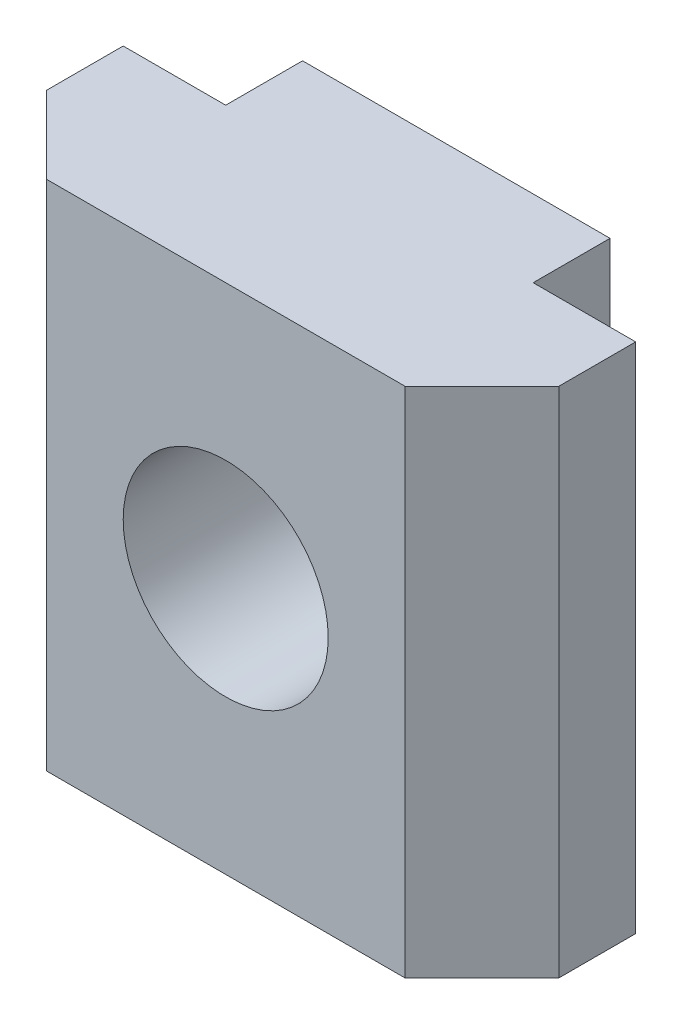
ISO-10303-21;
HEADER;
FILE_DESCRIPTION(('STEP AP214'),'2;1');
FILE_NAME('part.step','',(''),(''),'','','');
FILE_SCHEMA(('AUTOMOTIVE_DESIGN { 1 0 10303 214 1 1 1 1 }'));
ENDSEC;
DATA;
#1=APPLICATION_CONTEXT('core data for automotive mechanical design processes');
#2=APPLICATION_PROTOCOL_DEFINITION('international standard','automotive_design',2000,#1);
#3=PRODUCT_CONTEXT('',#1,'mechanical');
#4=PRODUCT('Part','Part','',(#3));
#5=PRODUCT_RELATED_PRODUCT_CATEGORY('part','',(#4));
#6=PRODUCT_DEFINITION_FORMATION('','',#4);
#7=PRODUCT_DEFINITION_CONTEXT('part definition',#1,'design');
#8=PRODUCT_DEFINITION('design','',#6,#7);
#9=PRODUCT_DEFINITION_SHAPE('','',#8);
#10=(LENGTH_UNIT() NAMED_UNIT(*) SI_UNIT(.MILLI.,.METRE.));
#11=(NAMED_UNIT(*) PLANE_ANGLE_UNIT() SI_UNIT($,.RADIAN.));
#12=(NAMED_UNIT(*) SI_UNIT($,.STERADIAN.) SOLID_ANGLE_UNIT());
#13=UNCERTAINTY_MEASURE_WITH_UNIT(LENGTH_MEASURE(1.E-05),#10,'distance_accuracy_value','');
#14=(GEOMETRIC_REPRESENTATION_CONTEXT(3) GLOBAL_UNCERTAINTY_ASSIGNED_CONTEXT((#13)) GLOBAL_UNIT_ASSIGNED_CONTEXT((#10,
#11,#12)) REPRESENTATION_CONTEXT('',''));
#15=CARTESIAN_POINT('',(0.,0.,0.));
#16=DIRECTION('',(0.,0.,1.));
#17=DIRECTION('',(1.,0.,0.));
#18=AXIS2_PLACEMENT_3D('',#15,#16,#17);
#19=CARTESIAN_POINT('',(3.5,10.,0.));
#20=DIRECTION('',(-0.707106781186549,0.,-0.707106781186546));
#21=DIRECTION('',(-0.707106781186546,0.,0.707106781186549));
#22=AXIS2_PLACEMENT_3D('',#19,#20,#21);
#23=PLANE('',#22);
#24=DIRECTION('',(0.707106781186546,0.,-0.707106781186549));
#25=VECTOR('',#24,1.);
#26=CARTESIAN_POINT('',(3.5,0.,0.));
#27=LINE('',#26,#25);
#28=CARTESIAN_POINT('',(3.5,0.,0.));
#29=VERTEX_POINT('',#28);
#30=CARTESIAN_POINT('',(4.99999999999999,0.,-1.5));
#31=VERTEX_POINT('',#30);
#32=EDGE_CURVE('E142',#29,#31,#27,.T.);
#33=ORIENTED_EDGE('',*,*,#32,.T.);
#34=DIRECTION('',(0.,-1.,0.));
#35=VECTOR('',#34,1.);
#36=CARTESIAN_POINT('',(4.99999999999999,10.,-1.5));
#37=LINE('',#36,#35);
#38=CARTESIAN_POINT('',(4.99999999999999,10.,-1.5));
#39=VERTEX_POINT('',#38);
#40=EDGE_CURVE('E11',#39,#31,#37,.T.);
#41=ORIENTED_EDGE('',*,*,#40,.F.);
#42=DIRECTION('',(0.707106781186546,0.,-0.707106781186549));
#43=VECTOR('',#42,1.);
#44=CARTESIAN_POINT('',(3.5,10.,0.));
#45=LINE('',#44,#43);
#46=CARTESIAN_POINT('',(3.5,10.,0.));
#47=VERTEX_POINT('',#46);
#48=EDGE_CURVE('E161',#47,#39,#45,.T.);
#49=ORIENTED_EDGE('',*,*,#48,.F.);
#50=DIRECTION('',(0.,-1.,0.));
#51=VECTOR('',#50,1.);
#52=CARTESIAN_POINT('',(3.5,10.,0.));
#53=LINE('',#52,#51);
#54=EDGE_CURVE('E138',#47,#29,#53,.T.);
#55=ORIENTED_EDGE('',*,*,#54,.T.);
#56=EDGE_LOOP('',(#33,#41,#49,#55));
#57=FACE_BOUND('',#56,.T.);
#58=ADVANCED_FACE('F34',(#57),#23,.F.);
#59=CARTESIAN_POINT('',(4.99999999999999,10.,-3.));
#60=DIRECTION('',(-1.,0.,0.));
#61=DIRECTION('',(0.,0.,1.));
#62=AXIS2_PLACEMENT_3D('',#59,#60,#61);
#63=PLANE('',#62);
#64=DIRECTION('',(0.,0.,-1.));
#65=VECTOR('',#64,1.);
#66=CARTESIAN_POINT('',(4.99999999999999,0.,-3.));
#67=LINE('',#66,#65);
#68=CARTESIAN_POINT('',(4.99999999999999,0.,-3.));
#69=VERTEX_POINT('',#68);
#70=EDGE_CURVE('E145',#31,#69,#67,.T.);
#71=ORIENTED_EDGE('',*,*,#70,.T.);
#72=DIRECTION('',(0.,-1.,0.));
#73=VECTOR('',#72,1.);
#74=CARTESIAN_POINT('',(4.99999999999999,10.,-3.));
#75=LINE('',#74,#73);
#76=CARTESIAN_POINT('',(4.99999999999999,10.,-3.));
#77=VERTEX_POINT('',#76);
#78=EDGE_CURVE('E42',#77,#69,#75,.T.);
#79=ORIENTED_EDGE('',*,*,#78,.F.);
#80=DIRECTION('',(0.,0.,-1.));
#81=VECTOR('',#80,1.);
#82=CARTESIAN_POINT('',(4.99999999999999,10.,-3.));
#83=LINE('',#82,#81);
#84=EDGE_CURVE('E99',#39,#77,#83,.T.);
#85=ORIENTED_EDGE('',*,*,#84,.F.);
#86=ORIENTED_EDGE('',*,*,#40,.T.);
#87=EDGE_LOOP('',(#71,#79,#85,#86));
#88=FACE_BOUND('',#87,.T.);
#89=ADVANCED_FACE('F232',(#88),#63,.F.);
#90=CARTESIAN_POINT('',(3.00000000000001,10.,-3.));
#91=DIRECTION('',(0.,0.,1.));
#92=DIRECTION('',(1.,0.,0.));
#93=AXIS2_PLACEMENT_3D('',#90,#91,#92);
#94=PLANE('',#93);
#95=DIRECTION('',(-1.,0.,0.));
#96=VECTOR('',#95,1.);
#97=CARTESIAN_POINT('',(3.00000000000001,0.,-3.));
#98=LINE('',#97,#96);
#99=CARTESIAN_POINT('',(3.00000000000001,0.,-3.));
#100=VERTEX_POINT('',#99);
#101=EDGE_CURVE('E148',#69,#100,#98,.T.);
#102=ORIENTED_EDGE('',*,*,#101,.T.);
#103=DIRECTION('',(0.,-1.,0.));
#104=VECTOR('',#103,1.);
#105=CARTESIAN_POINT('',(3.00000000000001,10.,-3.));
#106=LINE('',#105,#104);
#107=CARTESIAN_POINT('',(3.00000000000001,10.,-3.));
#108=VERTEX_POINT('',#107);
#109=EDGE_CURVE('E174',#108,#100,#106,.T.);
#110=ORIENTED_EDGE('',*,*,#109,.F.);
#111=DIRECTION('',(-1.,0.,0.));
#112=VECTOR('',#111,1.);
#113=CARTESIAN_POINT('',(3.00000000000001,10.,-3.));
#114=LINE('',#113,#112);
#115=EDGE_CURVE('E182',#77,#108,#114,.T.);
#116=ORIENTED_EDGE('',*,*,#115,.F.);
#117=ORIENTED_EDGE('',*,*,#78,.T.);
#118=EDGE_LOOP('',(#102,#110,#116,#117));
#119=FACE_BOUND('',#118,.T.);
#120=ADVANCED_FACE('F180',(#119),#94,.F.);
#121=CARTESIAN_POINT('',(3.00000000000001,10.,-4.5));
#122=DIRECTION('',(-1.,0.,0.));
#123=DIRECTION('',(0.,0.,1.));
#124=AXIS2_PLACEMENT_3D('',#121,#122,#123);
#125=PLANE('',#124);
#126=DIRECTION('',(0.,0.,-1.));
#127=VECTOR('',#126,1.);
#128=CARTESIAN_POINT('',(3.00000000000001,0.,-4.5));
#129=LINE('',#128,#127);
#130=CARTESIAN_POINT('',(3.00000000000001,0.,-4.5));
#131=VERTEX_POINT('',#130);
#132=EDGE_CURVE('E150',#100,#131,#129,.T.);
#133=ORIENTED_EDGE('',*,*,#132,.T.);
#134=DIRECTION('',(0.,-1.,0.));
#135=VECTOR('',#134,1.);
#136=CARTESIAN_POINT('',(3.00000000000001,10.,-4.5));
#137=LINE('',#136,#135);
#138=CARTESIAN_POINT('',(3.00000000000001,10.,-4.5));
#139=VERTEX_POINT('',#138);
#140=EDGE_CURVE('E171',#139,#131,#137,.T.);
#141=ORIENTED_EDGE('',*,*,#140,.F.);
#142=DIRECTION('',(0.,0.,-1.));
#143=VECTOR('',#142,1.);
#144=CARTESIAN_POINT('',(3.00000000000001,10.,-4.5));
#145=LINE('',#144,#143);
#146=EDGE_CURVE('E200',#108,#139,#145,.T.);
#147=ORIENTED_EDGE('',*,*,#146,.F.);
#148=ORIENTED_EDGE('',*,*,#109,.T.);
#149=EDGE_LOOP('',(#133,#141,#147,#148));
#150=FACE_BOUND('',#149,.T.);
#151=ADVANCED_FACE('F191',(#150),#125,.F.);
#152=CARTESIAN_POINT('',(-2.99999999999999,10.,-4.5));
#153=DIRECTION('',(0.,0.,1.));
#154=DIRECTION('',(1.,0.,0.));
#155=AXIS2_PLACEMENT_3D('',#152,#153,#154);
#156=PLANE('',#155);
#157=CARTESIAN_POINT('',(0.,5.,-4.5));
#158=DIRECTION('',(0.,0.,1.));
#159=DIRECTION('',(1.,0.,0.));
#160=AXIS2_PLACEMENT_3D('',#157,#158,#159);
#161=CIRCLE('',#160,2.);
#162=CARTESIAN_POINT('',(2.,5.,-4.5));
#163=VERTEX_POINT('',#162);
#164=EDGE_CURVE('E146',#163,#163,#161,.T.);
#165=ORIENTED_EDGE('',*,*,#164,.T.);
#166=EDGE_LOOP('',(#165));
#167=FACE_BOUND('',#166,.T.);
#168=DIRECTION('',(-1.,0.,0.));
#169=VECTOR('',#168,1.);
#170=CARTESIAN_POINT('',(-2.99999999999999,0.,-4.5));
#171=LINE('',#170,#169);
#172=CARTESIAN_POINT('',(-2.99999999999999,0.,-4.5));
#173=VERTEX_POINT('',#172);
#174=EDGE_CURVE('E152',#131,#173,#171,.T.);
#175=ORIENTED_EDGE('',*,*,#174,.T.);
#176=DIRECTION('',(0.,-1.,0.));
#177=VECTOR('',#176,1.);
#178=CARTESIAN_POINT('',(-2.99999999999999,10.,-4.5));
#179=LINE('',#178,#177);
#180=CARTESIAN_POINT('',(-2.99999999999999,10.,-4.5));
#181=VERTEX_POINT('',#180);
#182=EDGE_CURVE('E168',#181,#173,#179,.T.);
#183=ORIENTED_EDGE('',*,*,#182,.F.);
#184=DIRECTION('',(-1.,0.,0.));
#185=VECTOR('',#184,1.);
#186=CARTESIAN_POINT('',(-2.99999999999999,10.,-4.5));
#187=LINE('',#186,#185);
#188=EDGE_CURVE('E197',#139,#181,#187,.T.);
#189=ORIENTED_EDGE('',*,*,#188,.F.);
#190=ORIENTED_EDGE('',*,*,#140,.T.);
#191=EDGE_LOOP('',(#175,#183,#189,#190));
#192=FACE_BOUND('',#191,.T.);
#193=ADVANCED_FACE('F195',(#167,#192),#156,.F.);
#194=CARTESIAN_POINT('',(-2.99999999999999,10.,-3.));
#195=DIRECTION('',(1.,0.,0.));
#196=DIRECTION('',(0.,0.,-1.));
#197=AXIS2_PLACEMENT_3D('',#194,#195,#196);
#198=PLANE('',#197);
#199=DIRECTION('',(0.,0.,1.));
#200=VECTOR('',#199,1.);
#201=CARTESIAN_POINT('',(-2.99999999999999,0.,-3.));
#202=LINE('',#201,#200);
#203=CARTESIAN_POINT('',(-2.99999999999999,0.,-3.));
#204=VERTEX_POINT('',#203);
#205=EDGE_CURVE('E154',#173,#204,#202,.T.);
#206=ORIENTED_EDGE('',*,*,#205,.T.);
#207=DIRECTION('',(0.,-1.,0.));
#208=VECTOR('',#207,1.);
#209=CARTESIAN_POINT('',(-2.99999999999999,10.,-3.));
#210=LINE('',#209,#208);
#211=CARTESIAN_POINT('',(-2.99999999999999,10.,-3.));
#212=VERTEX_POINT('',#211);
#213=EDGE_CURVE('E165',#212,#204,#210,.T.);
#214=ORIENTED_EDGE('',*,*,#213,.F.);
#215=DIRECTION('',(0.,0.,1.));
#216=VECTOR('',#215,1.);
#217=CARTESIAN_POINT('',(-2.99999999999999,10.,-3.));
#218=LINE('',#217,#216);
#219=EDGE_CURVE('E199',#181,#212,#218,.T.);
#220=ORIENTED_EDGE('',*,*,#219,.F.);
#221=ORIENTED_EDGE('',*,*,#182,.T.);
#222=EDGE_LOOP('',(#206,#214,#220,#221));
#223=FACE_BOUND('',#222,.T.);
#224=ADVANCED_FACE('F244',(#223),#198,.F.);
#225=CARTESIAN_POINT('',(-5.00000000000002,10.,-3.));
#226=DIRECTION('',(0.,0.,1.));
#227=DIRECTION('',(1.,0.,0.));
#228=AXIS2_PLACEMENT_3D('',#225,#226,#227);
#229=PLANE('',#228);
#230=DIRECTION('',(-1.,0.,0.));
#231=VECTOR('',#230,1.);
#232=CARTESIAN_POINT('',(-5.00000000000002,0.,-3.));
#233=LINE('',#232,#231);
#234=CARTESIAN_POINT('',(-5.00000000000002,0.,-3.));
#235=VERTEX_POINT('',#234);
#236=EDGE_CURVE('E156',#204,#235,#233,.T.);
#237=ORIENTED_EDGE('',*,*,#236,.T.);
#238=DIRECTION('',(0.,-1.,0.));
#239=VECTOR('',#238,1.);
#240=CARTESIAN_POINT('',(-5.00000000000002,10.,-3.));
#241=LINE('',#240,#239);
#242=CARTESIAN_POINT('',(-5.00000000000002,10.,-3.));
#243=VERTEX_POINT('',#242);
#244=EDGE_CURVE('E133',#243,#235,#241,.T.);
#245=ORIENTED_EDGE('',*,*,#244,.F.);
#246=DIRECTION('',(-1.,0.,0.));
#247=VECTOR('',#246,1.);
#248=CARTESIAN_POINT('',(-5.00000000000002,10.,-3.));
#249=LINE('',#248,#247);
#250=EDGE_CURVE('E124',#212,#243,#249,.T.);
#251=ORIENTED_EDGE('',*,*,#250,.F.);
#252=ORIENTED_EDGE('',*,*,#213,.T.);
#253=EDGE_LOOP('',(#237,#245,#251,#252));
#254=FACE_BOUND('',#253,.T.);
#255=ADVANCED_FACE('F241',(#254),#229,.F.);
#256=CARTESIAN_POINT('',(-5.00000000000002,10.,-1.5));
#257=DIRECTION('',(1.,0.,0.));
#258=DIRECTION('',(0.,0.,-1.));
#259=AXIS2_PLACEMENT_3D('',#256,#257,#258);
#260=PLANE('',#259);
#261=DIRECTION('',(0.,0.,1.));
#262=VECTOR('',#261,1.);
#263=CARTESIAN_POINT('',(-5.00000000000002,0.,-1.5));
#264=LINE('',#263,#262);
#265=CARTESIAN_POINT('',(-5.00000000000002,0.,-1.5));
#266=VERTEX_POINT('',#265);
#267=EDGE_CURVE('E132',#235,#266,#264,.T.);
#268=ORIENTED_EDGE('',*,*,#267,.T.);
#269=DIRECTION('',(0.,-1.,0.));
#270=VECTOR('',#269,1.);
#271=CARTESIAN_POINT('',(-5.00000000000002,10.,-1.5));
#272=LINE('',#271,#270);
#273=CARTESIAN_POINT('',(-5.00000000000002,10.,-1.5));
#274=VERTEX_POINT('',#273);
#275=EDGE_CURVE('E129',#274,#266,#272,.T.);
#276=ORIENTED_EDGE('',*,*,#275,.F.);
#277=DIRECTION('',(0.,0.,1.));
#278=VECTOR('',#277,1.);
#279=CARTESIAN_POINT('',(-5.00000000000002,10.,-1.5));
#280=LINE('',#279,#278);
#281=EDGE_CURVE('E118',#243,#274,#280,.T.);
#282=ORIENTED_EDGE('',*,*,#281,.F.);
#283=ORIENTED_EDGE('',*,*,#244,.T.);
#284=EDGE_LOOP('',(#268,#276,#282,#283));
#285=FACE_BOUND('',#284,.T.);
#286=ADVANCED_FACE('F130',(#285),#260,.F.);
#287=CARTESIAN_POINT('',(-3.5,10.,0.));
#288=DIRECTION('',(0.707106781186544,0.,-0.707106781186552));
#289=DIRECTION('',(-0.707106781186552,0.,-0.707106781186544));
#290=AXIS2_PLACEMENT_3D('',#287,#288,#289);
#291=PLANE('',#290);
#292=DIRECTION('',(0.707106781186552,0.,0.707106781186544));
#293=VECTOR('',#292,1.);
#294=CARTESIAN_POINT('',(-3.5,0.,0.));
#295=LINE('',#294,#293);
#296=CARTESIAN_POINT('',(-3.5,0.,0.));
#297=VERTEX_POINT('',#296);
#298=EDGE_CURVE('E85',#266,#297,#295,.T.);
#299=ORIENTED_EDGE('',*,*,#298,.T.);
#300=DIRECTION('',(0.,-1.,0.));
#301=VECTOR('',#300,1.);
#302=CARTESIAN_POINT('',(-3.5,10.,0.));
#303=LINE('',#302,#301);
#304=CARTESIAN_POINT('',(-3.5,10.,0.));
#305=VERTEX_POINT('',#304);
#306=EDGE_CURVE('E134',#305,#297,#303,.T.);
#307=ORIENTED_EDGE('',*,*,#306,.F.);
#308=DIRECTION('',(0.707106781186552,0.,0.707106781186544));
#309=VECTOR('',#308,1.);
#310=CARTESIAN_POINT('',(-3.5,10.,0.));
#311=LINE('',#310,#309);
#312=EDGE_CURVE('E122',#274,#305,#311,.T.);
#313=ORIENTED_EDGE('',*,*,#312,.F.);
#314=ORIENTED_EDGE('',*,*,#275,.T.);
#315=EDGE_LOOP('',(#299,#307,#313,#314));
#316=FACE_BOUND('',#315,.T.);
#317=ADVANCED_FACE('F136',(#316),#291,.F.);
#318=CARTESIAN_POINT('',(-3.5,10.,0.));
#319=DIRECTION('',(0.,0.,-1.));
#320=DIRECTION('',(-1.,0.,0.));
#321=AXIS2_PLACEMENT_3D('',#318,#319,#320);
#322=PLANE('',#321);
#323=CARTESIAN_POINT('',(0.,5.,0.));
#324=DIRECTION('',(0.,0.,1.));
#325=DIRECTION('',(1.,0.,0.));
#326=AXIS2_PLACEMENT_3D('',#323,#324,#325);
#327=CIRCLE('',#326,2.);
#328=CARTESIAN_POINT('',(2.,5.,0.));
#329=VERTEX_POINT('',#328);
#330=EDGE_CURVE('E208',#329,#329,#327,.T.);
#331=ORIENTED_EDGE('',*,*,#330,.F.);
#332=EDGE_LOOP('',(#331));
#333=FACE_BOUND('',#332,.T.);
#334=DIRECTION('',(1.,0.,0.));
#335=VECTOR('',#334,1.);
#336=CARTESIAN_POINT('',(-3.5,0.,0.));
#337=LINE('',#336,#335);
#338=EDGE_CURVE('E91',#297,#29,#337,.T.);
#339=ORIENTED_EDGE('',*,*,#338,.T.);
#340=ORIENTED_EDGE('',*,*,#54,.F.);
#341=DIRECTION('',(1.,0.,0.));
#342=VECTOR('',#341,1.);
#343=CARTESIAN_POINT('',(-3.5,10.,0.));
#344=LINE('',#343,#342);
#345=EDGE_CURVE('E50',#305,#47,#344,.T.);
#346=ORIENTED_EDGE('',*,*,#345,.F.);
#347=ORIENTED_EDGE('',*,*,#306,.T.);
#348=EDGE_LOOP('',(#339,#340,#346,#347));
#349=FACE_BOUND('',#348,.T.);
#350=ADVANCED_FACE('F221',(#333,#349),#322,.F.);
#351=CARTESIAN_POINT('',(0.,10.,0.));
#352=DIRECTION('',(0.,1.,0.));
#353=DIRECTION('',(0.,0.,1.));
#354=AXIS2_PLACEMENT_3D('',#351,#352,#353);
#355=PLANE('',#354);
#356=ORIENTED_EDGE('',*,*,#48,.T.);
#357=ORIENTED_EDGE('',*,*,#84,.T.);
#358=ORIENTED_EDGE('',*,*,#115,.T.);
#359=ORIENTED_EDGE('',*,*,#146,.T.);
#360=ORIENTED_EDGE('',*,*,#188,.T.);
#361=ORIENTED_EDGE('',*,*,#219,.T.);
#362=ORIENTED_EDGE('',*,*,#250,.T.);
#363=ORIENTED_EDGE('',*,*,#281,.T.);
#364=ORIENTED_EDGE('',*,*,#312,.T.);
#365=ORIENTED_EDGE('',*,*,#345,.T.);
#366=EDGE_LOOP('',(#356,#357,#358,#359,#360,#361,#362,#363,#364,#365));
#367=FACE_BOUND('',#366,.T.);
#368=ADVANCED_FACE('F120',(#367),#355,.T.);
#369=CARTESIAN_POINT('',(0.,0.,0.));
#370=DIRECTION('',(0.,1.,0.));
#371=DIRECTION('',(0.,0.,1.));
#372=AXIS2_PLACEMENT_3D('',#369,#370,#371);
#373=PLANE('',#372);
#374=ORIENTED_EDGE('',*,*,#32,.F.);
#375=ORIENTED_EDGE('',*,*,#338,.F.);
#376=ORIENTED_EDGE('',*,*,#298,.F.);
#377=ORIENTED_EDGE('',*,*,#267,.F.);
#378=ORIENTED_EDGE('',*,*,#236,.F.);
#379=ORIENTED_EDGE('',*,*,#205,.F.);
#380=ORIENTED_EDGE('',*,*,#174,.F.);
#381=ORIENTED_EDGE('',*,*,#132,.F.);
#382=ORIENTED_EDGE('',*,*,#101,.F.);
#383=ORIENTED_EDGE('',*,*,#70,.F.);
#384=EDGE_LOOP('',(#374,#375,#376,#377,#378,#379,#380,#381,#382,#383));
#385=FACE_BOUND('',#384,.T.);
#386=ADVANCED_FACE('F186',(#385),#373,.F.);
#387=CARTESIAN_POINT('',(0.,5.,-4.5));
#388=DIRECTION('',(0.,0.,1.));
#389=DIRECTION('',(1.,0.,0.));
#390=AXIS2_PLACEMENT_3D('',#387,#388,#389);
#391=CYLINDRICAL_SURFACE('',#390,2.);
#392=ORIENTED_EDGE('',*,*,#164,.F.);
#393=EDGE_LOOP('',(#392));
#394=FACE_BOUND('',#393,.T.);
#395=ORIENTED_EDGE('',*,*,#330,.T.);
#396=EDGE_LOOP('',(#395));
#397=FACE_BOUND('',#396,.T.);
#398=ADVANCED_FACE('F215',(#394,#397),#391,.F.);
#399=CLOSED_SHELL('',(#58,#89,#120,#151,#193,#224,#255,#286,#317,#350,#368,#386,#398));
#400=MANIFOLD_SOLID_BREP('B2',#399);
#401=ADVANCED_BREP_SHAPE_REPRESENTATION('',(#18,#400),#14);
#402=SHAPE_DEFINITION_REPRESENTATION(#9,#401);
ENDSEC;
END-ISO-10303-21;
